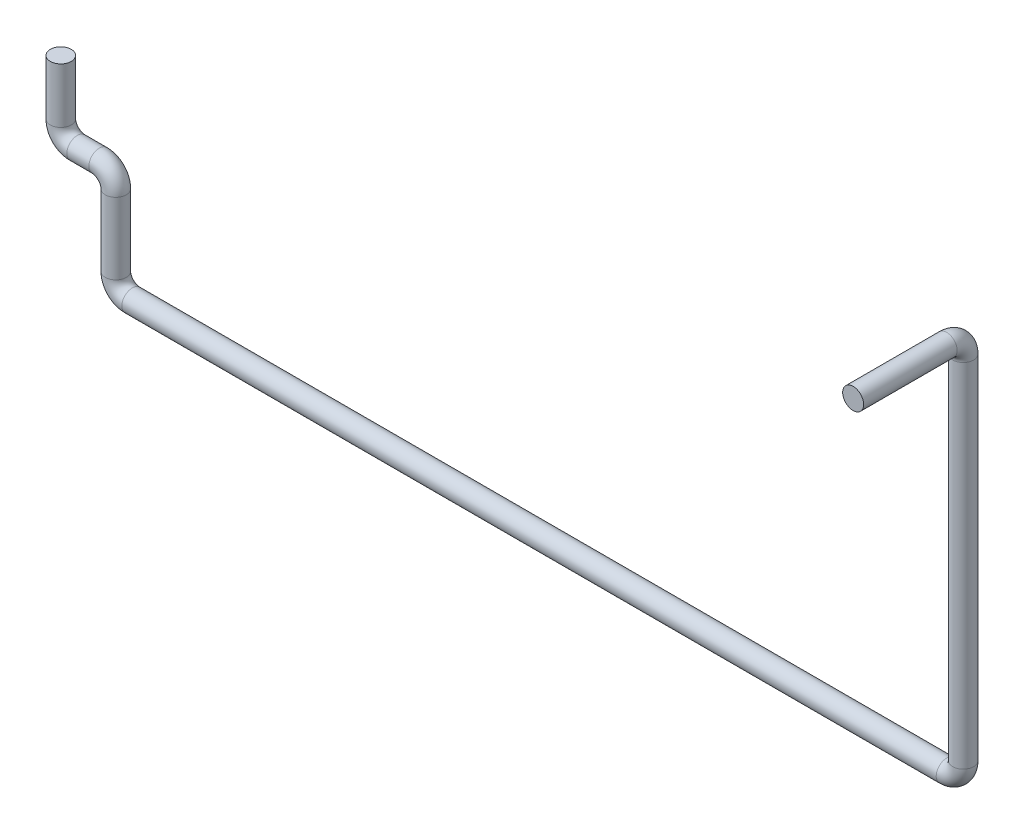
ISO-10303-21;
HEADER;
FILE_DESCRIPTION(('STEP AP214'),'2;1');
FILE_NAME('part.step','',(''),(''),'','','');
FILE_SCHEMA(('AUTOMOTIVE_DESIGN { 1 0 10303 214 1 1 1 1 }'));
ENDSEC;
DATA;
#1=APPLICATION_CONTEXT('core data for automotive mechanical design processes');
#2=APPLICATION_PROTOCOL_DEFINITION('international standard','automotive_design',2000,#1);
#3=PRODUCT_CONTEXT('',#1,'mechanical');
#4=PRODUCT('Part','Part','',(#3));
#5=PRODUCT_RELATED_PRODUCT_CATEGORY('part','',(#4));
#6=PRODUCT_DEFINITION_FORMATION('','',#4);
#7=PRODUCT_DEFINITION_CONTEXT('part definition',#1,'design');
#8=PRODUCT_DEFINITION('design','',#6,#7);
#9=PRODUCT_DEFINITION_SHAPE('','',#8);
#10=(LENGTH_UNIT() NAMED_UNIT(*) SI_UNIT(.MILLI.,.METRE.));
#11=(NAMED_UNIT(*) PLANE_ANGLE_UNIT() SI_UNIT($,.RADIAN.));
#12=(NAMED_UNIT(*) SI_UNIT($,.STERADIAN.) SOLID_ANGLE_UNIT());
#13=UNCERTAINTY_MEASURE_WITH_UNIT(LENGTH_MEASURE(1.E-05),#10,'distance_accuracy_value','');
#14=(GEOMETRIC_REPRESENTATION_CONTEXT(3) GLOBAL_UNCERTAINTY_ASSIGNED_CONTEXT((#13)) GLOBAL_UNIT_ASSIGNED_CONTEXT((#10,
#11,#12)) REPRESENTATION_CONTEXT('',''));
#15=CARTESIAN_POINT('',(0.,0.,0.));
#16=DIRECTION('',(0.,0.,1.));
#17=DIRECTION('',(1.,0.,0.));
#18=AXIS2_PLACEMENT_3D('',#15,#16,#17);
#19=CARTESIAN_POINT('',(0.,-10.,0.));
#20=DIRECTION('',(0.,1.,0.));
#21=DIRECTION('',(0.,0.,1.));
#22=AXIS2_PLACEMENT_3D('',#19,#20,#21);
#23=CYLINDRICAL_SURFACE('',#22,9.525);
#24=CARTESIAN_POINT('',(0.,0.,0.));
#25=DIRECTION('',(0.,1.,0.));
#26=DIRECTION('',(0.,0.,1.));
#27=AXIS2_PLACEMENT_3D('',#24,#25,#26);
#28=CIRCLE('',#27,9.525);
#29=CARTESIAN_POINT('',(0.,0.,9.525));
#30=VERTEX_POINT('',#29);
#31=EDGE_CURVE('E11',#30,#30,#28,.T.);
#32=ORIENTED_EDGE('',*,*,#31,.F.);
#33=EDGE_LOOP('',(#32));
#34=FACE_BOUND('',#33,.T.);
#35=CARTESIAN_POINT('',(0.,-50.,0.));
#36=DIRECTION('',(0.,-1.,0.));
#37=DIRECTION('',(0.,0.,-1.));
#38=AXIS2_PLACEMENT_3D('',#35,#36,#37);
#39=CIRCLE('',#38,9.525);
#40=CARTESIAN_POINT('',(-9.52500000000001,-50.,0.));
#41=VERTEX_POINT('',#40);
#42=EDGE_CURVE('E75',#41,#41,#39,.T.);
#43=ORIENTED_EDGE('',*,*,#42,.F.);
#44=EDGE_LOOP('',(#43));
#45=FACE_BOUND('',#44,.T.);
#46=ADVANCED_FACE('F35',(#34,#45),#23,.T.);
#47=CARTESIAN_POINT('',(0.,0.,0.));
#48=DIRECTION('',(0.,1.,0.));
#49=DIRECTION('',(0.,0.,1.));
#50=AXIS2_PLACEMENT_3D('',#47,#48,#49);
#51=PLANE('',#50);
#52=ORIENTED_EDGE('',*,*,#31,.T.);
#53=EDGE_LOOP('',(#52));
#54=FACE_BOUND('',#53,.T.);
#55=ADVANCED_FACE('F82',(#54),#51,.T.);
#56=CARTESIAN_POINT('',(820.,190.,100.));
#57=DIRECTION('',(0.,0.,1.));
#58=DIRECTION('',(0.,1.,0.));
#59=AXIS2_PLACEMENT_3D('',#56,#57,#58);
#60=PLANE('',#59);
#61=CARTESIAN_POINT('',(820.,190.,100.));
#62=DIRECTION('',(0.,0.,1.));
#63=DIRECTION('',(0.,1.,0.));
#64=AXIS2_PLACEMENT_3D('',#61,#62,#63);
#65=CIRCLE('',#64,9.525);
#66=CARTESIAN_POINT('',(820.,199.525,100.));
#67=VERTEX_POINT('',#66);
#68=EDGE_CURVE('E41',#67,#67,#65,.T.);
#69=ORIENTED_EDGE('',*,*,#68,.T.);
#70=EDGE_LOOP('',(#69));
#71=FACE_BOUND('',#70,.T.);
#72=ADVANCED_FACE('F45',(#71),#60,.T.);
#73=CARTESIAN_POINT('',(15.,-50.,0.));
#74=DIRECTION('',(0.,0.,1.));
#75=DIRECTION('',(1.,0.,0.));
#76=AXIS2_PLACEMENT_3D('',#73,#74,#75);
#77=TOROIDAL_SURFACE('',#76,15.,9.525);
#78=CARTESIAN_POINT('',(15.,-65.,0.));
#79=DIRECTION('',(1.,0.,0.));
#80=DIRECTION('',(0.,0.,-1.));
#81=AXIS2_PLACEMENT_3D('',#78,#79,#80);
#82=CIRCLE('',#81,9.525);
#83=CARTESIAN_POINT('',(15.,-74.525,0.));
#84=VERTEX_POINT('',#83);
#85=EDGE_CURVE('E72',#84,#84,#82,.T.);
#86=CARTESIAN_POINT('',(15.,-50.,0.));
#87=DIRECTION('',(0.,0.,1.));
#88=DIRECTION('',(1.,0.,0.));
#89=AXIS2_PLACEMENT_3D('',#86,#87,#88);
#90=CIRCLE('',#89,24.525);
#91=EDGE_CURVE('',#41,#84,#90,.T.);
#92=ORIENTED_EDGE('',*,*,#42,.T.);
#93=ORIENTED_EDGE('',*,*,#85,.F.);
#94=ORIENTED_EDGE('',*,*,#91,.T.);
#95=ORIENTED_EDGE('',*,*,#91,.F.);
#96=EDGE_LOOP('',(#92,#94,#93,#95));
#97=FACE_BOUND('',#96,.T.);
#98=ADVANCED_FACE('F79',(#97),#77,.T.);
#99=CARTESIAN_POINT('',(15.,-65.,0.));
#100=DIRECTION('',(1.,0.,0.));
#101=DIRECTION('',(0.,0.,-1.));
#102=AXIS2_PLACEMENT_3D('',#99,#100,#101);
#103=CYLINDRICAL_SURFACE('',#102,9.525);
#104=CARTESIAN_POINT('',(35.,-65.,0.));
#105=DIRECTION('',(1.,0.,0.));
#106=DIRECTION('',(0.,0.,-1.));
#107=AXIS2_PLACEMENT_3D('',#104,#105,#106);
#108=CIRCLE('',#107,9.525);
#109=CARTESIAN_POINT('',(35.,-55.475,0.));
#110=VERTEX_POINT('',#109);
#111=EDGE_CURVE('E69',#110,#110,#108,.T.);
#112=ORIENTED_EDGE('',*,*,#111,.F.);
#113=EDGE_LOOP('',(#112));
#114=FACE_BOUND('',#113,.T.);
#115=ORIENTED_EDGE('',*,*,#85,.T.);
#116=EDGE_LOOP('',(#115));
#117=FACE_BOUND('',#116,.T.);
#118=ADVANCED_FACE('F127',(#114,#117),#103,.T.);
#119=CARTESIAN_POINT('',(35.,-80.,0.));
#120=DIRECTION('',(0.,0.,-1.));
#121=DIRECTION('',(-1.,0.,0.));
#122=AXIS2_PLACEMENT_3D('',#119,#120,#121);
#123=TOROIDAL_SURFACE('',#122,15.,9.525);
#124=CARTESIAN_POINT('',(50.,-80.,0.));
#125=DIRECTION('',(0.,-1.,0.));
#126=DIRECTION('',(0.,0.,-1.));
#127=AXIS2_PLACEMENT_3D('',#124,#125,#126);
#128=CIRCLE('',#127,9.525);
#129=CARTESIAN_POINT('',(59.525,-80.,0.));
#130=VERTEX_POINT('',#129);
#131=EDGE_CURVE('E66',#130,#130,#128,.T.);
#132=CARTESIAN_POINT('',(35.,-80.,0.));
#133=DIRECTION('',(0.,0.,-1.));
#134=DIRECTION('',(-1.,0.,0.));
#135=AXIS2_PLACEMENT_3D('',#132,#133,#134);
#136=CIRCLE('',#135,24.525);
#137=EDGE_CURVE('',#110,#130,#136,.T.);
#138=ORIENTED_EDGE('',*,*,#111,.T.);
#139=ORIENTED_EDGE('',*,*,#131,.F.);
#140=ORIENTED_EDGE('',*,*,#137,.T.);
#141=ORIENTED_EDGE('',*,*,#137,.F.);
#142=EDGE_LOOP('',(#138,#140,#139,#141));
#143=FACE_BOUND('',#142,.T.);
#144=ADVANCED_FACE('F123',(#143),#123,.T.);
#145=CARTESIAN_POINT('',(50.,-80.,0.));
#146=DIRECTION('',(0.,-1.,0.));
#147=DIRECTION('',(0.,0.,-1.));
#148=AXIS2_PLACEMENT_3D('',#145,#146,#147);
#149=CYLINDRICAL_SURFACE('',#148,9.525);
#150=CARTESIAN_POINT('',(50.,-145.,0.));
#151=DIRECTION('',(0.,-1.,0.));
#152=DIRECTION('',(0.,0.,-1.));
#153=AXIS2_PLACEMENT_3D('',#150,#151,#152);
#154=CIRCLE('',#153,9.525);
#155=CARTESIAN_POINT('',(40.475,-145.,0.));
#156=VERTEX_POINT('',#155);
#157=EDGE_CURVE('E63',#156,#156,#154,.T.);
#158=ORIENTED_EDGE('',*,*,#157,.F.);
#159=EDGE_LOOP('',(#158));
#160=FACE_BOUND('',#159,.T.);
#161=ORIENTED_EDGE('',*,*,#131,.T.);
#162=EDGE_LOOP('',(#161));
#163=FACE_BOUND('',#162,.T.);
#164=ADVANCED_FACE('F119',(#160,#163),#149,.T.);
#165=CARTESIAN_POINT('',(65.,-145.,0.));
#166=DIRECTION('',(0.,0.,1.));
#167=DIRECTION('',(1.,0.,0.));
#168=AXIS2_PLACEMENT_3D('',#165,#166,#167);
#169=TOROIDAL_SURFACE('',#168,15.,9.525);
#170=CARTESIAN_POINT('',(65.,-160.,0.));
#171=DIRECTION('',(1.,0.,0.));
#172=DIRECTION('',(0.,0.,-1.));
#173=AXIS2_PLACEMENT_3D('',#170,#171,#172);
#174=CIRCLE('',#173,9.525);
#175=CARTESIAN_POINT('',(65.,-169.525,0.));
#176=VERTEX_POINT('',#175);
#177=EDGE_CURVE('E60',#176,#176,#174,.T.);
#178=CARTESIAN_POINT('',(65.,-145.,0.));
#179=DIRECTION('',(0.,0.,1.));
#180=DIRECTION('',(1.,0.,0.));
#181=AXIS2_PLACEMENT_3D('',#178,#179,#180);
#182=CIRCLE('',#181,24.525);
#183=EDGE_CURVE('',#156,#176,#182,.T.);
#184=ORIENTED_EDGE('',*,*,#157,.T.);
#185=ORIENTED_EDGE('',*,*,#177,.F.);
#186=ORIENTED_EDGE('',*,*,#183,.T.);
#187=ORIENTED_EDGE('',*,*,#183,.F.);
#188=EDGE_LOOP('',(#184,#186,#185,#187));
#189=FACE_BOUND('',#188,.T.);
#190=ADVANCED_FACE('F115',(#189),#169,.T.);
#191=CARTESIAN_POINT('',(65.,-160.,0.));
#192=DIRECTION('',(1.,0.,0.));
#193=DIRECTION('',(0.,0.,-1.));
#194=AXIS2_PLACEMENT_3D('',#191,#192,#193);
#195=CYLINDRICAL_SURFACE('',#194,9.525);
#196=CARTESIAN_POINT('',(805.,-160.,0.));
#197=DIRECTION('',(1.,0.,0.));
#198=DIRECTION('',(0.,0.,-1.));
#199=AXIS2_PLACEMENT_3D('',#196,#197,#198);
#200=CIRCLE('',#199,9.525);
#201=CARTESIAN_POINT('',(805.,-169.525,0.));
#202=VERTEX_POINT('',#201);
#203=EDGE_CURVE('E57',#202,#202,#200,.T.);
#204=ORIENTED_EDGE('',*,*,#203,.F.);
#205=EDGE_LOOP('',(#204));
#206=FACE_BOUND('',#205,.T.);
#207=ORIENTED_EDGE('',*,*,#177,.T.);
#208=EDGE_LOOP('',(#207));
#209=FACE_BOUND('',#208,.T.);
#210=ADVANCED_FACE('F111',(#206,#209),#195,.T.);
#211=CARTESIAN_POINT('',(805.,-145.,0.));
#212=DIRECTION('',(0.,0.,1.));
#213=DIRECTION('',(1.,0.,0.));
#214=AXIS2_PLACEMENT_3D('',#211,#212,#213);
#215=TOROIDAL_SURFACE('',#214,15.,9.525);
#216=CARTESIAN_POINT('',(820.,-145.,0.));
#217=DIRECTION('',(0.,1.,0.));
#218=DIRECTION('',(0.,0.,-1.));
#219=AXIS2_PLACEMENT_3D('',#216,#217,#218);
#220=CIRCLE('',#219,9.525);
#221=CARTESIAN_POINT('',(829.525,-145.,0.));
#222=VERTEX_POINT('',#221);
#223=EDGE_CURVE('E54',#222,#222,#220,.T.);
#224=CARTESIAN_POINT('',(805.,-145.,0.));
#225=DIRECTION('',(0.,0.,1.));
#226=DIRECTION('',(1.,0.,0.));
#227=AXIS2_PLACEMENT_3D('',#224,#225,#226);
#228=CIRCLE('',#227,24.525);
#229=EDGE_CURVE('',#202,#222,#228,.T.);
#230=ORIENTED_EDGE('',*,*,#203,.T.);
#231=ORIENTED_EDGE('',*,*,#223,.F.);
#232=ORIENTED_EDGE('',*,*,#229,.T.);
#233=ORIENTED_EDGE('',*,*,#229,.F.);
#234=EDGE_LOOP('',(#230,#232,#231,#233));
#235=FACE_BOUND('',#234,.T.);
#236=ADVANCED_FACE('F107',(#235),#215,.T.);
#237=CARTESIAN_POINT('',(820.,-145.,0.));
#238=DIRECTION('',(0.,1.,0.));
#239=DIRECTION('',(-1.,0.,0.));
#240=AXIS2_PLACEMENT_3D('',#237,#238,#239);
#241=CYLINDRICAL_SURFACE('',#240,9.525);
#242=CARTESIAN_POINT('',(820.,175.,0.));
#243=DIRECTION('',(0.,1.,0.));
#244=DIRECTION('',(0.,0.,-1.));
#245=AXIS2_PLACEMENT_3D('',#242,#243,#244);
#246=CIRCLE('',#245,9.525);
#247=CARTESIAN_POINT('',(820.,175.,-9.52500000000001));
#248=VERTEX_POINT('',#247);
#249=EDGE_CURVE('E49',#248,#248,#246,.T.);
#250=ORIENTED_EDGE('',*,*,#249,.F.);
#251=EDGE_LOOP('',(#250));
#252=FACE_BOUND('',#251,.T.);
#253=ORIENTED_EDGE('',*,*,#223,.T.);
#254=EDGE_LOOP('',(#253));
#255=FACE_BOUND('',#254,.T.);
#256=ADVANCED_FACE('F100',(#252,#255),#241,.T.);
#257=CARTESIAN_POINT('',(820.,175.,15.));
#258=DIRECTION('',(1.,0.,0.));
#259=DIRECTION('',(0.,0.,-1.));
#260=AXIS2_PLACEMENT_3D('',#257,#258,#259);
#261=TOROIDAL_SURFACE('',#260,15.,9.525);
#262=CARTESIAN_POINT('',(820.,190.,15.));
#263=DIRECTION('',(0.,0.,1.));
#264=DIRECTION('',(0.,1.,0.));
#265=AXIS2_PLACEMENT_3D('',#262,#263,#264);
#266=CIRCLE('',#265,9.525);
#267=CARTESIAN_POINT('',(820.,199.525,15.));
#268=VERTEX_POINT('',#267);
#269=EDGE_CURVE('E47',#268,#268,#266,.T.);
#270=CARTESIAN_POINT('',(820.,175.,15.));
#271=DIRECTION('',(1.,0.,0.));
#272=DIRECTION('',(0.,0.,-1.));
#273=AXIS2_PLACEMENT_3D('',#270,#271,#272);
#274=CIRCLE('',#273,24.525);
#275=EDGE_CURVE('',#248,#268,#274,.T.);
#276=ORIENTED_EDGE('',*,*,#249,.T.);
#277=ORIENTED_EDGE('',*,*,#269,.F.);
#278=ORIENTED_EDGE('',*,*,#275,.T.);
#279=ORIENTED_EDGE('',*,*,#275,.F.);
#280=EDGE_LOOP('',(#276,#278,#277,#279));
#281=FACE_BOUND('',#280,.T.);
#282=ADVANCED_FACE('F95',(#281),#261,.T.);
#283=CARTESIAN_POINT('',(820.,190.,15.));
#284=DIRECTION('',(0.,0.,1.));
#285=DIRECTION('',(1.,0.,0.));
#286=AXIS2_PLACEMENT_3D('',#283,#284,#285);
#287=CYLINDRICAL_SURFACE('',#286,9.525);
#288=ORIENTED_EDGE('',*,*,#68,.F.);
#289=EDGE_LOOP('',(#288));
#290=FACE_BOUND('',#289,.T.);
#291=ORIENTED_EDGE('',*,*,#269,.T.);
#292=EDGE_LOOP('',(#291));
#293=FACE_BOUND('',#292,.T.);
#294=ADVANCED_FACE('F88',(#290,#293),#287,.T.);
#295=CLOSED_SHELL('',(#46,#55,#72,#98,#118,#144,#164,#190,#210,#236,#256,#282,#294));
#296=MANIFOLD_SOLID_BREP('B2',#295);
#297=ADVANCED_BREP_SHAPE_REPRESENTATION('',(#18,#296),#14);
#298=SHAPE_DEFINITION_REPRESENTATION(#9,#297);
ENDSEC;
END-ISO-10303-21;
